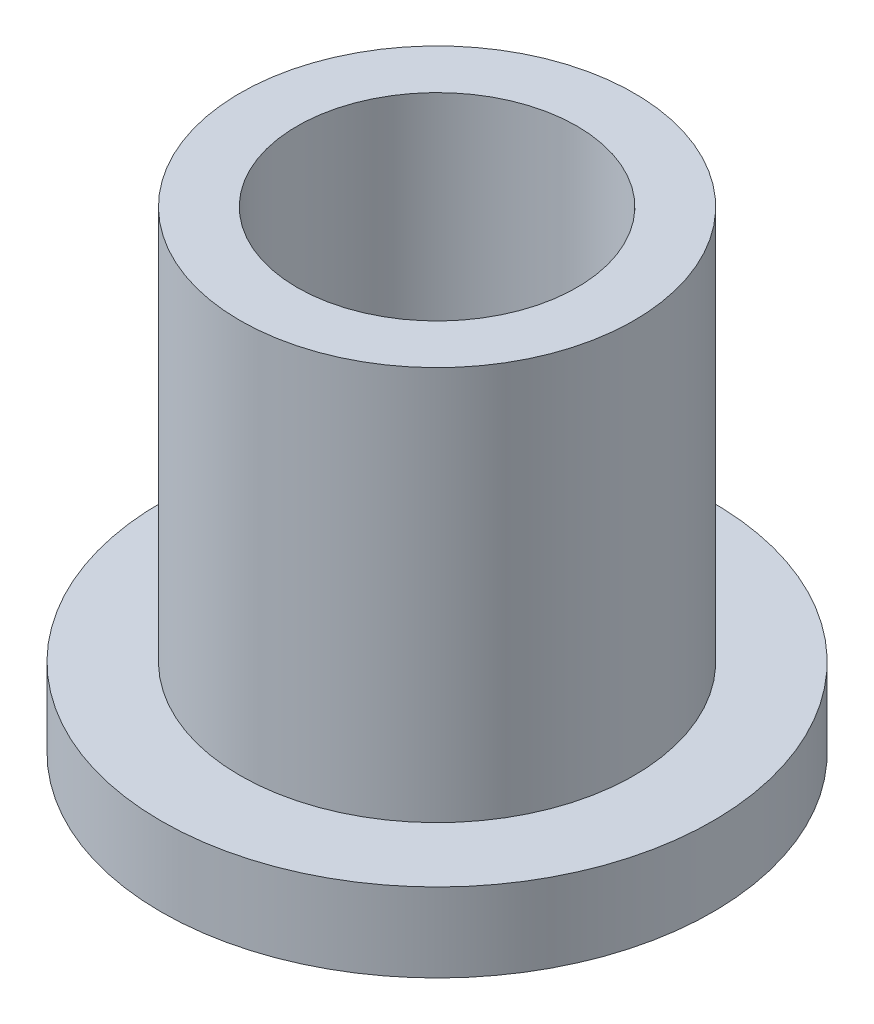
ISO-10303-21;
HEADER;
FILE_DESCRIPTION(('STEP AP214'),'2;1');
FILE_NAME('part.step','',(''),(''),'','','');
FILE_SCHEMA(('AUTOMOTIVE_DESIGN { 1 0 10303 214 1 1 1 1 }'));
ENDSEC;
DATA;
#1=APPLICATION_CONTEXT('core data for automotive mechanical design processes');
#2=APPLICATION_PROTOCOL_DEFINITION('international standard','automotive_design',2000,#1);
#3=PRODUCT_CONTEXT('',#1,'mechanical');
#4=PRODUCT('Part','Part','',(#3));
#5=PRODUCT_RELATED_PRODUCT_CATEGORY('part','',(#4));
#6=PRODUCT_DEFINITION_FORMATION('','',#4);
#7=PRODUCT_DEFINITION_CONTEXT('part definition',#1,'design');
#8=PRODUCT_DEFINITION('design','',#6,#7);
#9=PRODUCT_DEFINITION_SHAPE('','',#8);
#10=(LENGTH_UNIT() NAMED_UNIT(*) SI_UNIT(.MILLI.,.METRE.));
#11=(NAMED_UNIT(*) PLANE_ANGLE_UNIT() SI_UNIT($,.RADIAN.));
#12=(NAMED_UNIT(*) SI_UNIT($,.STERADIAN.) SOLID_ANGLE_UNIT());
#13=UNCERTAINTY_MEASURE_WITH_UNIT(LENGTH_MEASURE(1.E-05),#10,'distance_accuracy_value','');
#14=(GEOMETRIC_REPRESENTATION_CONTEXT(3) GLOBAL_UNCERTAINTY_ASSIGNED_CONTEXT((#13)) GLOBAL_UNIT_ASSIGNED_CONTEXT((#10,
#11,#12)) REPRESENTATION_CONTEXT('',''));
#15=CARTESIAN_POINT('',(0.,0.,0.));
#16=DIRECTION('',(0.,0.,1.));
#17=DIRECTION('',(1.,0.,0.));
#18=AXIS2_PLACEMENT_3D('',#15,#16,#17);
#19=CARTESIAN_POINT('',(0.,2.,0.));
#20=DIRECTION('',(0.,1.,0.));
#21=DIRECTION('',(0.,0.,1.));
#22=AXIS2_PLACEMENT_3D('',#19,#20,#21);
#23=PLANE('',#22);
#24=CARTESIAN_POINT('',(0.,2.,0.));
#25=DIRECTION('',(0.,1.,0.));
#26=DIRECTION('',(0.,0.,1.));
#27=AXIS2_PLACEMENT_3D('',#24,#25,#26);
#28=CIRCLE('',#27,7.);
#29=CARTESIAN_POINT('',(0.,2.,7.));
#30=VERTEX_POINT('',#29);
#31=EDGE_CURVE('E10',#30,#30,#28,.T.);
#32=ORIENTED_EDGE('',*,*,#31,.T.);
#33=EDGE_LOOP('',(#32));
#34=FACE_BOUND('',#33,.T.);
#35=CARTESIAN_POINT('',(0.,2.,0.));
#36=DIRECTION('',(0.,1.,0.));
#37=DIRECTION('',(0.,0.,1.));
#38=AXIS2_PLACEMENT_3D('',#35,#36,#37);
#39=CIRCLE('',#38,5.);
#40=CARTESIAN_POINT('',(0.,2.,5.));
#41=VERTEX_POINT('',#40);
#42=EDGE_CURVE('E56',#41,#41,#39,.T.);
#43=ORIENTED_EDGE('',*,*,#42,.F.);
#44=EDGE_LOOP('',(#43));
#45=FACE_BOUND('',#44,.T.);
#46=ADVANCED_FACE('F37',(#34,#45),#23,.T.);
#47=CARTESIAN_POINT('',(0.,0.,0.));
#48=DIRECTION('',(0.,1.,0.));
#49=DIRECTION('',(0.,0.,1.));
#50=AXIS2_PLACEMENT_3D('',#47,#48,#49);
#51=PLANE('',#50);
#52=CARTESIAN_POINT('',(0.,0.,0.));
#53=DIRECTION('',(0.,1.,0.));
#54=DIRECTION('',(0.,0.,1.));
#55=AXIS2_PLACEMENT_3D('',#52,#53,#54);
#56=CIRCLE('',#55,7.);
#57=CARTESIAN_POINT('',(0.,0.,7.));
#58=VERTEX_POINT('',#57);
#59=EDGE_CURVE('E41',#58,#58,#56,.T.);
#60=ORIENTED_EDGE('',*,*,#59,.F.);
#61=EDGE_LOOP('',(#60));
#62=FACE_BOUND('',#61,.T.);
#63=CARTESIAN_POINT('',(0.,0.,0.));
#64=DIRECTION('',(0.,1.,0.));
#65=DIRECTION('',(0.,0.,1.));
#66=AXIS2_PLACEMENT_3D('',#63,#64,#65);
#67=CIRCLE('',#66,3.55);
#68=CARTESIAN_POINT('',(0.,0.,3.55));
#69=VERTEX_POINT('',#68);
#70=EDGE_CURVE('E50',#69,#69,#67,.T.);
#71=ORIENTED_EDGE('',*,*,#70,.T.);
#72=EDGE_LOOP('',(#71));
#73=FACE_BOUND('',#72,.T.);
#74=ADVANCED_FACE('F84',(#62,#73),#51,.F.);
#75=CARTESIAN_POINT('',(0.,2.,0.));
#76=DIRECTION('',(0.,-1.,0.));
#77=DIRECTION('',(0.,0.,-1.));
#78=AXIS2_PLACEMENT_3D('',#75,#76,#77);
#79=CYLINDRICAL_SURFACE('',#78,7.);
#80=ORIENTED_EDGE('',*,*,#31,.F.);
#81=EDGE_LOOP('',(#80));
#82=FACE_BOUND('',#81,.T.);
#83=ORIENTED_EDGE('',*,*,#59,.T.);
#84=EDGE_LOOP('',(#83));
#85=FACE_BOUND('',#84,.T.);
#86=ADVANCED_FACE('F39',(#82,#85),#79,.T.);
#87=CARTESIAN_POINT('',(0.,2.,0.));
#88=DIRECTION('',(0.,-1.,0.));
#89=DIRECTION('',(0.,0.,-1.));
#90=AXIS2_PLACEMENT_3D('',#87,#88,#89);
#91=CYLINDRICAL_SURFACE('',#90,3.55);
#92=ORIENTED_EDGE('',*,*,#70,.F.);
#93=EDGE_LOOP('',(#92));
#94=FACE_BOUND('',#93,.T.);
#95=CARTESIAN_POINT('',(0.,12.,0.));
#96=DIRECTION('',(0.,1.,0.));
#97=DIRECTION('',(0.,0.,1.));
#98=AXIS2_PLACEMENT_3D('',#95,#96,#97);
#99=CIRCLE('',#98,3.55);
#100=CARTESIAN_POINT('',(0.,12.,3.55));
#101=VERTEX_POINT('',#100);
#102=EDGE_CURVE('E60',#101,#101,#99,.T.);
#103=ORIENTED_EDGE('',*,*,#102,.T.);
#104=EDGE_LOOP('',(#103));
#105=FACE_BOUND('',#104,.T.);
#106=ADVANCED_FACE('F68',(#94,#105),#91,.F.);
#107=CARTESIAN_POINT('',(0.,12.,0.));
#108=DIRECTION('',(0.,1.,0.));
#109=DIRECTION('',(0.,0.,1.));
#110=AXIS2_PLACEMENT_3D('',#107,#108,#109);
#111=PLANE('',#110);
#112=CARTESIAN_POINT('',(0.,12.,0.));
#113=DIRECTION('',(0.,1.,0.));
#114=DIRECTION('',(0.,0.,1.));
#115=AXIS2_PLACEMENT_3D('',#112,#113,#114);
#116=CIRCLE('',#115,5.);
#117=CARTESIAN_POINT('',(0.,12.,5.));
#118=VERTEX_POINT('',#117);
#119=EDGE_CURVE('E55',#118,#118,#116,.T.);
#120=ORIENTED_EDGE('',*,*,#119,.T.);
#121=EDGE_LOOP('',(#120));
#122=FACE_BOUND('',#121,.T.);
#123=ORIENTED_EDGE('',*,*,#102,.F.);
#124=EDGE_LOOP('',(#123));
#125=FACE_BOUND('',#124,.T.);
#126=ADVANCED_FACE('F70',(#122,#125),#111,.T.);
#127=CARTESIAN_POINT('',(0.,12.,0.));
#128=DIRECTION('',(0.,-1.,0.));
#129=DIRECTION('',(0.,0.,-1.));
#130=AXIS2_PLACEMENT_3D('',#127,#128,#129);
#131=CYLINDRICAL_SURFACE('',#130,5.);
#132=ORIENTED_EDGE('',*,*,#119,.F.);
#133=EDGE_LOOP('',(#132));
#134=FACE_BOUND('',#133,.T.);
#135=ORIENTED_EDGE('',*,*,#42,.T.);
#136=EDGE_LOOP('',(#135));
#137=FACE_BOUND('',#136,.T.);
#138=ADVANCED_FACE('F72',(#134,#137),#131,.T.);
#139=CLOSED_SHELL('',(#46,#74,#86,#106,#126,#138));
#140=MANIFOLD_SOLID_BREP('B2',#139);
#141=ADVANCED_BREP_SHAPE_REPRESENTATION('',(#18,#140),#14);
#142=SHAPE_DEFINITION_REPRESENTATION(#9,#141);
ENDSEC;
END-ISO-10303-21;
